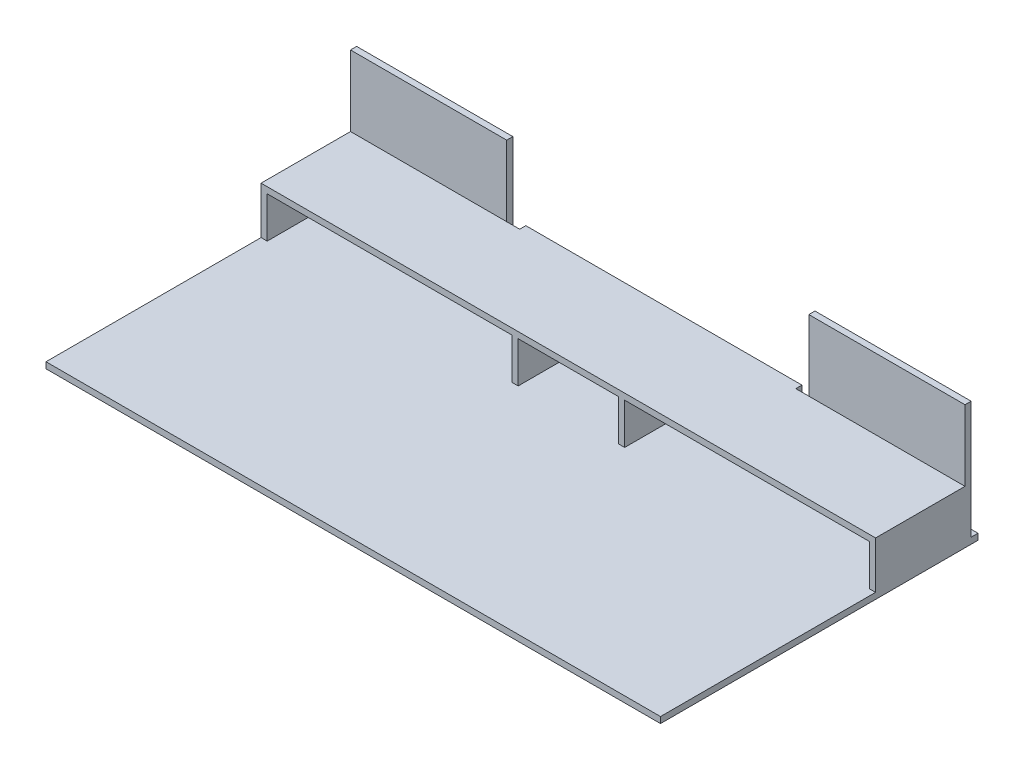
ISO-10303-21;
HEADER;
FILE_DESCRIPTION(('STEP AP214'),'2;1');
FILE_NAME('part.step','',(''),(''),'','','');
FILE_SCHEMA(('AUTOMOTIVE_DESIGN { 1 0 10303 214 1 1 1 1 }'));
ENDSEC;
DATA;
#1=APPLICATION_CONTEXT('core data for automotive mechanical design processes');
#2=APPLICATION_PROTOCOL_DEFINITION('international standard','automotive_design',2000,#1);
#3=PRODUCT_CONTEXT('',#1,'mechanical');
#4=PRODUCT('Part','Part','',(#3));
#5=PRODUCT_RELATED_PRODUCT_CATEGORY('part','',(#4));
#6=PRODUCT_DEFINITION_FORMATION('','',#4);
#7=PRODUCT_DEFINITION_CONTEXT('part definition',#1,'design');
#8=PRODUCT_DEFINITION('design','',#6,#7);
#9=PRODUCT_DEFINITION_SHAPE('','',#8);
#10=(LENGTH_UNIT() NAMED_UNIT(*) SI_UNIT(.MILLI.,.METRE.));
#11=(NAMED_UNIT(*) PLANE_ANGLE_UNIT() SI_UNIT($,.RADIAN.));
#12=(NAMED_UNIT(*) SI_UNIT($,.STERADIAN.) SOLID_ANGLE_UNIT());
#13=UNCERTAINTY_MEASURE_WITH_UNIT(LENGTH_MEASURE(1.E-05),#10,'distance_accuracy_value','');
#14=(GEOMETRIC_REPRESENTATION_CONTEXT(3) GLOBAL_UNCERTAINTY_ASSIGNED_CONTEXT((#13)) GLOBAL_UNIT_ASSIGNED_CONTEXT((#10,
#11,#12)) REPRESENTATION_CONTEXT('',''));
#15=CARTESIAN_POINT('',(0.,0.,0.));
#16=DIRECTION('',(0.,0.,1.));
#17=DIRECTION('',(1.,0.,0.));
#18=AXIS2_PLACEMENT_3D('',#15,#16,#17);
#19=CARTESIAN_POINT('',(0.,92.,-284.6));
#20=DIRECTION('',(0.,0.,-1.));
#21=DIRECTION('',(-1.,0.,0.));
#22=AXIS2_PLACEMENT_3D('',#19,#20,#21);
#23=PLANE('',#22);
#24=DIRECTION('',(-1.,0.,0.));
#25=VECTOR('',#24,1.);
#26=CARTESIAN_POINT('',(-600.,92.,-284.6));
#27=LINE('',#26,#25);
#28=CARTESIAN_POINT('',(295.,92.,-284.6));
#29=VERTEX_POINT('',#28);
#30=CARTESIAN_POINT('',(269.6,92.,-284.6));
#31=VERTEX_POINT('',#30);
#32=EDGE_CURVE('E556',#29,#31,#27,.T.);
#33=ORIENTED_EDGE('',*,*,#32,.T.);
#34=DIRECTION('',(0.,-1.,0.));
#35=VECTOR('',#34,1.);
#36=CARTESIAN_POINT('',(269.6,104.,-284.6));
#37=LINE('',#36,#35);
#38=CARTESIAN_POINT('',(269.6,104.,-284.6));
#39=VERTEX_POINT('',#38);
#40=EDGE_CURVE('E555',#39,#31,#37,.T.);
#41=ORIENTED_EDGE('',*,*,#40,.F.);
#42=DIRECTION('',(-1.,0.,0.));
#43=VECTOR('',#42,1.);
#44=CARTESIAN_POINT('',(-600.,104.,-284.6));
#45=LINE('',#44,#43);
#46=CARTESIAN_POINT('',(295.,104.,-284.6));
#47=VERTEX_POINT('',#46);
#48=EDGE_CURVE('E366',#47,#39,#45,.T.);
#49=ORIENTED_EDGE('',*,*,#48,.F.);
#50=DIRECTION('',(0.,-1.,0.));
#51=VECTOR('',#50,1.);
#52=CARTESIAN_POINT('',(295.,242.,-284.6));
#53=LINE('',#52,#51);
#54=EDGE_CURVE('E314',#47,#29,#53,.T.);
#55=ORIENTED_EDGE('',*,*,#54,.T.);
#56=EDGE_LOOP('',(#33,#41,#49,#55));
#57=FACE_BOUND('',#56,.T.);
#58=ADVANCED_FACE('F33',(#57),#23,.T.);
#59=DIRECTION('',(0.,-1.,0.));
#60=VECTOR('',#59,1.);
#61=CARTESIAN_POINT('',(-110.,92.,-284.6));
#62=LINE('',#61,#60);
#63=CARTESIAN_POINT('',(-110.,69.,-284.6));
#64=VERTEX_POINT('',#63);
#65=CARTESIAN_POINT('',(-110.,12.,-284.6));
#66=VERTEX_POINT('',#65);
#67=EDGE_CURVE('E445',#64,#66,#62,.T.);
#68=ORIENTED_EDGE('',*,*,#67,.F.);
#69=DIRECTION('',(-1.,0.,0.));
#70=VECTOR('',#69,1.);
#71=CARTESIAN_POINT('',(269.6,69.,-284.6));
#72=LINE('',#71,#70);
#73=CARTESIAN_POINT('',(-98.0000000000003,69.,-284.6));
#74=VERTEX_POINT('',#73);
#75=EDGE_CURVE('E560',#74,#64,#72,.T.);
#76=ORIENTED_EDGE('',*,*,#75,.F.);
#77=DIRECTION('',(0.,-1.,0.));
#78=VECTOR('',#77,1.);
#79=CARTESIAN_POINT('',(-98.0000000000003,92.,-284.6));
#80=LINE('',#79,#78);
#81=CARTESIAN_POINT('',(-98.0000000000003,12.,-284.6));
#82=VERTEX_POINT('',#81);
#83=EDGE_CURVE('E427',#74,#82,#80,.T.);
#84=ORIENTED_EDGE('',*,*,#83,.T.);
#85=DIRECTION('',(1.,0.,0.));
#86=VECTOR('',#85,1.);
#87=CARTESIAN_POINT('',(0.,12.,-284.6));
#88=LINE('',#87,#86);
#89=EDGE_CURVE('E420',#66,#82,#88,.T.);
#90=ORIENTED_EDGE('',*,*,#89,.F.);
#91=EDGE_LOOP('',(#68,#76,#84,#90));
#92=FACE_BOUND('',#91,.T.);
#93=ADVANCED_FACE('F605',(#92),#23,.T.);
#94=DIRECTION('',(0.,-1.,0.));
#95=VECTOR('',#94,1.);
#96=CARTESIAN_POINT('',(98.0000000000003,92.,-284.6));
#97=LINE('',#96,#95);
#98=CARTESIAN_POINT('',(98.0000000000003,69.,-284.6));
#99=VERTEX_POINT('',#98);
#100=CARTESIAN_POINT('',(98.0000000000003,12.,-284.6));
#101=VERTEX_POINT('',#100);
#102=EDGE_CURVE('E416',#99,#101,#97,.T.);
#103=ORIENTED_EDGE('',*,*,#102,.F.);
#104=CARTESIAN_POINT('',(110.,69.,-284.6));
#105=VERTEX_POINT('',#104);
#106=EDGE_CURVE('E567',#105,#99,#72,.T.);
#107=ORIENTED_EDGE('',*,*,#106,.F.);
#108=DIRECTION('',(0.,-1.,0.));
#109=VECTOR('',#108,1.);
#110=CARTESIAN_POINT('',(110.,92.,-284.6));
#111=LINE('',#110,#109);
#112=CARTESIAN_POINT('',(110.,12.,-284.6));
#113=VERTEX_POINT('',#112);
#114=EDGE_CURVE('E399',#105,#113,#111,.T.);
#115=ORIENTED_EDGE('',*,*,#114,.T.);
#116=DIRECTION('',(1.,0.,0.));
#117=VECTOR('',#116,1.);
#118=CARTESIAN_POINT('',(0.,12.,-284.6));
#119=LINE('',#118,#117);
#120=EDGE_CURVE('E392',#101,#113,#119,.T.);
#121=ORIENTED_EDGE('',*,*,#120,.F.);
#122=EDGE_LOOP('',(#103,#107,#115,#121));
#123=FACE_BOUND('',#122,.T.);
#124=ADVANCED_FACE('F627',(#123),#23,.T.);
#125=CARTESIAN_POINT('',(-269.6,104.,-284.6));
#126=VERTEX_POINT('',#125);
#127=CARTESIAN_POINT('',(-295.,104.,-284.6));
#128=VERTEX_POINT('',#127);
#129=EDGE_CURVE('E367',#126,#128,#45,.T.);
#130=ORIENTED_EDGE('',*,*,#129,.F.);
#131=DIRECTION('',(0.,1.,0.));
#132=VECTOR('',#131,1.);
#133=CARTESIAN_POINT('',(-269.6,104.,-284.6));
#134=LINE('',#133,#132);
#135=CARTESIAN_POINT('',(-269.6,92.,-284.6));
#136=VERTEX_POINT('',#135);
#137=EDGE_CURVE('E566',#136,#126,#134,.T.);
#138=ORIENTED_EDGE('',*,*,#137,.F.);
#139=CARTESIAN_POINT('',(-295.,92.,-284.6));
#140=VERTEX_POINT('',#139);
#141=EDGE_CURVE('E375',#136,#140,#27,.T.);
#142=ORIENTED_EDGE('',*,*,#141,.T.);
#143=DIRECTION('',(0.,-1.,0.));
#144=VECTOR('',#143,1.);
#145=CARTESIAN_POINT('',(-295.,242.,-284.6));
#146=LINE('',#145,#144);
#147=EDGE_CURVE('E346',#128,#140,#146,.T.);
#148=ORIENTED_EDGE('',*,*,#147,.F.);
#149=EDGE_LOOP('',(#130,#138,#142,#148));
#150=FACE_BOUND('',#149,.T.);
#151=ADVANCED_FACE('F577',(#150),#23,.T.);
#152=CARTESIAN_POINT('',(0.,12.,0.));
#153=DIRECTION('',(0.,1.,0.));
#154=DIRECTION('',(0.,0.,1.));
#155=AXIS2_PLACEMENT_3D('',#152,#153,#154);
#156=PLANE('',#155);
#157=ORIENTED_EDGE('',*,*,#120,.T.);
#158=DIRECTION('',(0.,0.,1.));
#159=VECTOR('',#158,1.);
#160=CARTESIAN_POINT('',(110.,12.,0.));
#161=LINE('',#160,#159);
#162=CARTESIAN_POINT('',(110.,12.,-110.));
#163=VERTEX_POINT('',#162);
#164=EDGE_CURVE('E396',#113,#163,#161,.T.);
#165=ORIENTED_EDGE('',*,*,#164,.T.);
#166=DIRECTION('',(-1.,0.,0.));
#167=VECTOR('',#166,1.);
#168=CARTESIAN_POINT('',(0.,12.,-110.));
#169=LINE('',#168,#167);
#170=CARTESIAN_POINT('',(98.0000000000004,12.,-110.));
#171=VERTEX_POINT('',#170);
#172=EDGE_CURVE('E405',#163,#171,#169,.T.);
#173=ORIENTED_EDGE('',*,*,#172,.T.);
#174=DIRECTION('',(0.,0.,1.));
#175=VECTOR('',#174,1.);
#176=CARTESIAN_POINT('',(98.0000000000004,12.,0.));
#177=LINE('',#176,#175);
#178=EDGE_CURVE('E402',#101,#171,#177,.T.);
#179=ORIENTED_EDGE('',*,*,#178,.F.);
#180=EDGE_LOOP('',(#157,#165,#173,#179));
#181=FACE_BOUND('',#180,.T.);
#182=ORIENTED_EDGE('',*,*,#89,.T.);
#183=DIRECTION('',(0.,0.,1.));
#184=VECTOR('',#183,1.);
#185=CARTESIAN_POINT('',(-98.0000000000003,12.,0.));
#186=LINE('',#185,#184);
#187=CARTESIAN_POINT('',(-98.0000000000003,12.,-110.));
#188=VERTEX_POINT('',#187);
#189=EDGE_CURVE('E424',#82,#188,#186,.T.);
#190=ORIENTED_EDGE('',*,*,#189,.T.);
#191=DIRECTION('',(1.,0.,0.));
#192=VECTOR('',#191,1.);
#193=CARTESIAN_POINT('',(0.,12.,-110.));
#194=LINE('',#193,#192);
#195=CARTESIAN_POINT('',(-110.,12.,-110.));
#196=VERTEX_POINT('',#195);
#197=EDGE_CURVE('E433',#196,#188,#194,.T.);
#198=ORIENTED_EDGE('',*,*,#197,.F.);
#199=DIRECTION('',(0.,0.,1.));
#200=VECTOR('',#199,1.);
#201=CARTESIAN_POINT('',(-110.,12.,0.));
#202=LINE('',#201,#200);
#203=EDGE_CURVE('E430',#66,#196,#202,.T.);
#204=ORIENTED_EDGE('',*,*,#203,.F.);
#205=EDGE_LOOP('',(#182,#190,#198,#204));
#206=FACE_BOUND('',#205,.T.);
#207=DIRECTION('',(0.,0.,1.));
#208=VECTOR('',#207,1.);
#209=CARTESIAN_POINT('',(295.,12.,-284.6));
#210=LINE('',#209,#208);
#211=CARTESIAN_POINT('',(295.,12.,-296.6));
#212=VERTEX_POINT('',#211);
#213=CARTESIAN_POINT('',(295.,12.,-284.6));
#214=VERTEX_POINT('',#213);
#215=EDGE_CURVE('E305',#212,#214,#210,.T.);
#216=ORIENTED_EDGE('',*,*,#215,.F.);
#217=DIRECTION('',(-1.,0.,0.));
#218=VECTOR('',#217,1.);
#219=CARTESIAN_POINT('',(600.,12.,-296.6));
#220=LINE('',#219,#218);
#221=CARTESIAN_POINT('',(600.,12.,-296.6));
#222=VERTEX_POINT('',#221);
#223=EDGE_CURVE('E288',#222,#212,#220,.T.);
#224=ORIENTED_EDGE('',*,*,#223,.F.);
#225=DIRECTION('',(0.,0.,-1.));
#226=VECTOR('',#225,1.);
#227=CARTESIAN_POINT('',(600.,12.,310.));
#228=LINE('',#227,#226);
#229=CARTESIAN_POINT('',(600.,12.,-310.));
#230=VERTEX_POINT('',#229);
#231=EDGE_CURVE('E472',#222,#230,#228,.T.);
#232=ORIENTED_EDGE('',*,*,#231,.T.);
#233=DIRECTION('',(-1.,0.,0.));
#234=VECTOR('',#233,1.);
#235=CARTESIAN_POINT('',(600.,12.,-310.));
#236=LINE('',#235,#234);
#237=CARTESIAN_POINT('',(-600.,12.,-310.));
#238=VERTEX_POINT('',#237);
#239=EDGE_CURVE('E475',#230,#238,#236,.T.);
#240=ORIENTED_EDGE('',*,*,#239,.T.);
#241=DIRECTION('',(0.,0.,1.));
#242=VECTOR('',#241,1.);
#243=CARTESIAN_POINT('',(-600.,12.,310.));
#244=LINE('',#243,#242);
#245=CARTESIAN_POINT('',(-600.,12.,-296.6));
#246=VERTEX_POINT('',#245);
#247=EDGE_CURVE('E466',#238,#246,#244,.T.);
#248=ORIENTED_EDGE('',*,*,#247,.T.);
#249=DIRECTION('',(-1.,0.,0.));
#250=VECTOR('',#249,1.);
#251=CARTESIAN_POINT('',(-600.,12.,-296.6));
#252=LINE('',#251,#250);
#253=CARTESIAN_POINT('',(-295.,12.,-296.6));
#254=VERTEX_POINT('',#253);
#255=EDGE_CURVE('E324',#254,#246,#252,.T.);
#256=ORIENTED_EDGE('',*,*,#255,.F.);
#257=DIRECTION('',(0.,0.,-1.));
#258=VECTOR('',#257,1.);
#259=CARTESIAN_POINT('',(-295.,12.,-284.6));
#260=LINE('',#259,#258);
#261=CARTESIAN_POINT('',(-295.,12.,-284.6));
#262=VERTEX_POINT('',#261);
#263=EDGE_CURVE('E333',#262,#254,#260,.T.);
#264=ORIENTED_EDGE('',*,*,#263,.F.);
#265=DIRECTION('',(1.,0.,0.));
#266=VECTOR('',#265,1.);
#267=CARTESIAN_POINT('',(-600.,12.,-284.6));
#268=LINE('',#267,#266);
#269=CARTESIAN_POINT('',(-588.,12.,-284.6));
#270=VERTEX_POINT('',#269);
#271=EDGE_CURVE('E319',#270,#262,#268,.T.);
#272=ORIENTED_EDGE('',*,*,#271,.F.);
#273=DIRECTION('',(0.,0.,1.));
#274=VECTOR('',#273,1.);
#275=CARTESIAN_POINT('',(-588.,12.,0.));
#276=LINE('',#275,#274);
#277=CARTESIAN_POINT('',(-588.,12.,-110.));
#278=VERTEX_POINT('',#277);
#279=EDGE_CURVE('E454',#270,#278,#276,.T.);
#280=ORIENTED_EDGE('',*,*,#279,.T.);
#281=DIRECTION('',(1.,0.,0.));
#282=VECTOR('',#281,1.);
#283=CARTESIAN_POINT('',(0.,12.,-110.));
#284=LINE('',#283,#282);
#285=CARTESIAN_POINT('',(-600.,12.,-110.));
#286=VERTEX_POINT('',#285);
#287=EDGE_CURVE('E449',#286,#278,#284,.T.);
#288=ORIENTED_EDGE('',*,*,#287,.F.);
#289=CARTESIAN_POINT('',(-600.,12.,310.));
#290=VERTEX_POINT('',#289);
#291=EDGE_CURVE('E470',#286,#290,#244,.T.);
#292=ORIENTED_EDGE('',*,*,#291,.T.);
#293=DIRECTION('',(1.,0.,0.));
#294=VECTOR('',#293,1.);
#295=CARTESIAN_POINT('',(600.,12.,310.));
#296=LINE('',#295,#294);
#297=CARTESIAN_POINT('',(600.,12.,310.));
#298=VERTEX_POINT('',#297);
#299=EDGE_CURVE('E469',#290,#298,#296,.T.);
#300=ORIENTED_EDGE('',*,*,#299,.T.);
#301=CARTESIAN_POINT('',(600.,12.,-110.));
#302=VERTEX_POINT('',#301);
#303=EDGE_CURVE('E473',#298,#302,#228,.T.);
#304=ORIENTED_EDGE('',*,*,#303,.T.);
#305=DIRECTION('',(-1.,0.,0.));
#306=VECTOR('',#305,1.);
#307=CARTESIAN_POINT('',(-1.27213054904965E-13,12.,-109.999999999999));
#308=LINE('',#307,#306);
#309=CARTESIAN_POINT('',(588.,12.,-110.));
#310=VERTEX_POINT('',#309);
#311=EDGE_CURVE('E380',#302,#310,#308,.T.);
#312=ORIENTED_EDGE('',*,*,#311,.T.);
#313=DIRECTION('',(0.,0.,1.));
#314=VECTOR('',#313,1.);
#315=CARTESIAN_POINT('',(588.,12.,0.));
#316=LINE('',#315,#314);
#317=CARTESIAN_POINT('',(588.,12.,-284.6));
#318=VERTEX_POINT('',#317);
#319=EDGE_CURVE('E365',#318,#310,#316,.T.);
#320=ORIENTED_EDGE('',*,*,#319,.F.);
#321=DIRECTION('',(1.,0.,0.));
#322=VECTOR('',#321,1.);
#323=CARTESIAN_POINT('',(600.,12.,-284.6));
#324=LINE('',#323,#322);
#325=EDGE_CURVE('E297',#214,#318,#324,.T.);
#326=ORIENTED_EDGE('',*,*,#325,.F.);
#327=EDGE_LOOP('',(#216,#224,#232,#240,#248,#256,#264,#272,#280,#288,#292,#300,#304,#312,#320,#326));
#328=FACE_BOUND('',#327,.T.);
#329=ADVANCED_FACE('F515',(#181,#206,#328),#156,.T.);
#330=CARTESIAN_POINT('',(-600.,12.,310.));
#331=DIRECTION('',(1.,0.,0.));
#332=DIRECTION('',(0.,0.,-1.));
#333=AXIS2_PLACEMENT_3D('',#330,#331,#332);
#334=PLANE('',#333);
#335=DIRECTION('',(0.,0.,1.));
#336=VECTOR('',#335,1.);
#337=CARTESIAN_POINT('',(-600.,0.,310.));
#338=LINE('',#337,#336);
#339=CARTESIAN_POINT('',(-600.,0.,-310.));
#340=VERTEX_POINT('',#339);
#341=CARTESIAN_POINT('',(-600.,0.,310.));
#342=VERTEX_POINT('',#341);
#343=EDGE_CURVE('E465',#340,#342,#338,.T.);
#344=ORIENTED_EDGE('',*,*,#343,.T.);
#345=DIRECTION('',(0.,-1.,0.));
#346=VECTOR('',#345,1.);
#347=CARTESIAN_POINT('',(-600.,12.,310.));
#348=LINE('',#347,#346);
#349=EDGE_CURVE('E11',#290,#342,#348,.T.);
#350=ORIENTED_EDGE('',*,*,#349,.F.);
#351=ORIENTED_EDGE('',*,*,#291,.F.);
#352=DIRECTION('',(0.,-1.,0.));
#353=VECTOR('',#352,1.);
#354=CARTESIAN_POINT('',(-600.,92.,-110.));
#355=LINE('',#354,#353);
#356=CARTESIAN_POINT('',(-600.,104.,-110.));
#357=VERTEX_POINT('',#356);
#358=EDGE_CURVE('E462',#357,#286,#355,.T.);
#359=ORIENTED_EDGE('',*,*,#358,.F.);
#360=DIRECTION('',(0.,0.,1.));
#361=VECTOR('',#360,1.);
#362=CARTESIAN_POINT('',(-600.,104.,-284.6));
#363=LINE('',#362,#361);
#364=CARTESIAN_POINT('',(-600.,104.,-284.6));
#365=VERTEX_POINT('',#364);
#366=EDGE_CURVE('E351',#365,#357,#363,.T.);
#367=ORIENTED_EDGE('',*,*,#366,.F.);
#368=DIRECTION('',(0.,-1.,0.));
#369=VECTOR('',#368,1.);
#370=CARTESIAN_POINT('',(-600.,242.,-284.6));
#371=LINE('',#370,#369);
#372=CARTESIAN_POINT('',(-600.,242.,-284.6));
#373=VERTEX_POINT('',#372);
#374=EDGE_CURVE('E345',#373,#365,#371,.T.);
#375=ORIENTED_EDGE('',*,*,#374,.F.);
#376=DIRECTION('',(0.,0.,1.));
#377=VECTOR('',#376,1.);
#378=CARTESIAN_POINT('',(-600.,242.,-284.6));
#379=LINE('',#378,#377);
#380=CARTESIAN_POINT('',(-600.,242.,-296.6));
#381=VERTEX_POINT('',#380);
#382=EDGE_CURVE('E320',#381,#373,#379,.T.);
#383=ORIENTED_EDGE('',*,*,#382,.F.);
#384=DIRECTION('',(0.,-1.,0.));
#385=VECTOR('',#384,1.);
#386=CARTESIAN_POINT('',(-600.,242.,-296.6));
#387=LINE('',#386,#385);
#388=EDGE_CURVE('E330',#381,#246,#387,.T.);
#389=ORIENTED_EDGE('',*,*,#388,.T.);
#390=ORIENTED_EDGE('',*,*,#247,.F.);
#391=DIRECTION('',(0.,-1.,0.));
#392=VECTOR('',#391,1.);
#393=CARTESIAN_POINT('',(-600.,12.,-310.));
#394=LINE('',#393,#392);
#395=EDGE_CURVE('E477',#238,#340,#394,.T.);
#396=ORIENTED_EDGE('',*,*,#395,.T.);
#397=EDGE_LOOP('',(#344,#350,#351,#359,#367,#375,#383,#389,#390,#396));
#398=FACE_BOUND('',#397,.T.);
#399=ADVANCED_FACE('F35',(#398),#334,.F.);
#400=CARTESIAN_POINT('',(600.,12.,310.));
#401=DIRECTION('',(0.,0.,-1.));
#402=DIRECTION('',(-1.,0.,0.));
#403=AXIS2_PLACEMENT_3D('',#400,#401,#402);
#404=PLANE('',#403);
#405=DIRECTION('',(1.,0.,0.));
#406=VECTOR('',#405,1.);
#407=CARTESIAN_POINT('',(600.,0.,310.));
#408=LINE('',#407,#406);
#409=CARTESIAN_POINT('',(600.,0.,310.));
#410=VERTEX_POINT('',#409);
#411=EDGE_CURVE('E480',#342,#410,#408,.T.);
#412=ORIENTED_EDGE('',*,*,#411,.T.);
#413=DIRECTION('',(0.,-1.,0.));
#414=VECTOR('',#413,1.);
#415=CARTESIAN_POINT('',(600.,12.,310.));
#416=LINE('',#415,#414);
#417=EDGE_CURVE('E41',#298,#410,#416,.T.);
#418=ORIENTED_EDGE('',*,*,#417,.F.);
#419=ORIENTED_EDGE('',*,*,#299,.F.);
#420=ORIENTED_EDGE('',*,*,#349,.T.);
#421=EDGE_LOOP('',(#412,#418,#419,#420));
#422=FACE_BOUND('',#421,.T.);
#423=ADVANCED_FACE('F541',(#422),#404,.F.);
#424=CARTESIAN_POINT('',(600.,12.,310.));
#425=DIRECTION('',(-1.,0.,0.));
#426=DIRECTION('',(0.,0.,1.));
#427=AXIS2_PLACEMENT_3D('',#424,#425,#426);
#428=PLANE('',#427);
#429=DIRECTION('',(0.,0.,-1.));
#430=VECTOR('',#429,1.);
#431=CARTESIAN_POINT('',(600.,0.,310.));
#432=LINE('',#431,#430);
#433=CARTESIAN_POINT('',(600.,0.,-310.));
#434=VERTEX_POINT('',#433);
#435=EDGE_CURVE('E482',#410,#434,#432,.T.);
#436=ORIENTED_EDGE('',*,*,#435,.T.);
#437=DIRECTION('',(0.,-1.,0.));
#438=VECTOR('',#437,1.);
#439=CARTESIAN_POINT('',(600.,12.,-310.));
#440=LINE('',#439,#438);
#441=EDGE_CURVE('E488',#230,#434,#440,.T.);
#442=ORIENTED_EDGE('',*,*,#441,.F.);
#443=ORIENTED_EDGE('',*,*,#231,.F.);
#444=DIRECTION('',(0.,-1.,0.));
#445=VECTOR('',#444,1.);
#446=CARTESIAN_POINT('',(600.,242.,-296.6));
#447=LINE('',#446,#445);
#448=CARTESIAN_POINT('',(600.,242.,-296.6));
#449=VERTEX_POINT('',#448);
#450=EDGE_CURVE('E317',#449,#222,#447,.T.);
#451=ORIENTED_EDGE('',*,*,#450,.F.);
#452=DIRECTION('',(0.,0.,-1.));
#453=VECTOR('',#452,1.);
#454=CARTESIAN_POINT('',(600.,242.,-284.6));
#455=LINE('',#454,#453);
#456=CARTESIAN_POINT('',(600.,242.,-284.6));
#457=VERTEX_POINT('',#456);
#458=EDGE_CURVE('E293',#457,#449,#455,.T.);
#459=ORIENTED_EDGE('',*,*,#458,.F.);
#460=DIRECTION('',(0.,-1.,0.));
#461=VECTOR('',#460,1.);
#462=CARTESIAN_POINT('',(600.,242.,-284.6));
#463=LINE('',#462,#461);
#464=CARTESIAN_POINT('',(600.,104.,-284.6));
#465=VERTEX_POINT('',#464);
#466=EDGE_CURVE('E303',#457,#465,#463,.T.);
#467=ORIENTED_EDGE('',*,*,#466,.T.);
#468=DIRECTION('',(0.,0.,-1.));
#469=VECTOR('',#468,1.);
#470=CARTESIAN_POINT('',(600.,104.,-284.6));
#471=LINE('',#470,#469);
#472=CARTESIAN_POINT('',(600.,104.,-110.));
#473=VERTEX_POINT('',#472);
#474=EDGE_CURVE('E358',#473,#465,#471,.T.);
#475=ORIENTED_EDGE('',*,*,#474,.F.);
#476=DIRECTION('',(0.,-1.,0.));
#477=VECTOR('',#476,1.);
#478=CARTESIAN_POINT('',(600.,92.,-110.));
#479=LINE('',#478,#477);
#480=EDGE_CURVE('E379',#473,#302,#479,.T.);
#481=ORIENTED_EDGE('',*,*,#480,.T.);
#482=ORIENTED_EDGE('',*,*,#303,.F.);
#483=ORIENTED_EDGE('',*,*,#417,.T.);
#484=EDGE_LOOP('',(#436,#442,#443,#451,#459,#467,#475,#481,#482,#483));
#485=FACE_BOUND('',#484,.T.);
#486=ADVANCED_FACE('F495',(#485),#428,.F.);
#487=CARTESIAN_POINT('',(600.,12.,-310.));
#488=DIRECTION('',(0.,0.,1.));
#489=DIRECTION('',(1.,0.,0.));
#490=AXIS2_PLACEMENT_3D('',#487,#488,#489);
#491=PLANE('',#490);
#492=DIRECTION('',(-1.,0.,0.));
#493=VECTOR('',#492,1.);
#494=CARTESIAN_POINT('',(600.,0.,-310.));
#495=LINE('',#494,#493);
#496=EDGE_CURVE('E484',#434,#340,#495,.T.);
#497=ORIENTED_EDGE('',*,*,#496,.T.);
#498=ORIENTED_EDGE('',*,*,#395,.F.);
#499=ORIENTED_EDGE('',*,*,#239,.F.);
#500=ORIENTED_EDGE('',*,*,#441,.T.);
#501=EDGE_LOOP('',(#497,#498,#499,#500));
#502=FACE_BOUND('',#501,.T.);
#503=ADVANCED_FACE('F505',(#502),#491,.F.);
#504=CARTESIAN_POINT('',(0.,0.,0.));
#505=DIRECTION('',(0.,1.,0.));
#506=DIRECTION('',(0.,0.,1.));
#507=AXIS2_PLACEMENT_3D('',#504,#505,#506);
#508=PLANE('',#507);
#509=ORIENTED_EDGE('',*,*,#343,.F.);
#510=ORIENTED_EDGE('',*,*,#496,.F.);
#511=ORIENTED_EDGE('',*,*,#435,.F.);
#512=ORIENTED_EDGE('',*,*,#411,.F.);
#513=EDGE_LOOP('',(#509,#510,#511,#512));
#514=FACE_BOUND('',#513,.T.);
#515=ADVANCED_FACE('F502',(#514),#508,.F.);
#516=CARTESIAN_POINT('',(0.,92.,-110.));
#517=DIRECTION('',(0.,0.,-1.));
#518=DIRECTION('',(-1.,0.,0.));
#519=AXIS2_PLACEMENT_3D('',#516,#517,#518);
#520=PLANE('',#519);
#521=ORIENTED_EDGE('',*,*,#287,.T.);
#522=DIRECTION('',(0.,-1.,0.));
#523=VECTOR('',#522,1.);
#524=CARTESIAN_POINT('',(-588.,92.,-110.));
#525=LINE('',#524,#523);
#526=CARTESIAN_POINT('',(-588.,92.,-110.));
#527=VERTEX_POINT('',#526);
#528=EDGE_CURVE('E459',#527,#278,#525,.T.);
#529=ORIENTED_EDGE('',*,*,#528,.F.);
#530=DIRECTION('',(1.,0.,0.));
#531=VECTOR('',#530,1.);
#532=CARTESIAN_POINT('',(-600.,92.,-110.));
#533=LINE('',#532,#531);
#534=CARTESIAN_POINT('',(-110.,92.,-110.));
#535=VERTEX_POINT('',#534);
#536=EDGE_CURVE('E371',#527,#535,#533,.T.);
#537=ORIENTED_EDGE('',*,*,#536,.T.);
#538=DIRECTION('',(0.,-1.,0.));
#539=VECTOR('',#538,1.);
#540=CARTESIAN_POINT('',(-110.,92.,-110.));
#541=LINE('',#540,#539);
#542=EDGE_CURVE('E442',#535,#196,#541,.T.);
#543=ORIENTED_EDGE('',*,*,#542,.T.);
#544=ORIENTED_EDGE('',*,*,#197,.T.);
#545=DIRECTION('',(0.,-1.,0.));
#546=VECTOR('',#545,1.);
#547=CARTESIAN_POINT('',(-98.0000000000003,92.,-110.));
#548=LINE('',#547,#546);
#549=CARTESIAN_POINT('',(-98.0000000000003,92.,-110.));
#550=VERTEX_POINT('',#549);
#551=EDGE_CURVE('E439',#550,#188,#548,.T.);
#552=ORIENTED_EDGE('',*,*,#551,.F.);
#553=CARTESIAN_POINT('',(98.0000000000003,92.,-110.));
#554=VERTEX_POINT('',#553);
#555=EDGE_CURVE('E370',#550,#554,#533,.T.);
#556=ORIENTED_EDGE('',*,*,#555,.T.);
#557=DIRECTION('',(0.,-1.,0.));
#558=VECTOR('',#557,1.);
#559=CARTESIAN_POINT('',(98.0000000000004,92.,-110.));
#560=LINE('',#559,#558);
#561=EDGE_CURVE('E413',#554,#171,#560,.T.);
#562=ORIENTED_EDGE('',*,*,#561,.T.);
#563=ORIENTED_EDGE('',*,*,#172,.F.);
#564=DIRECTION('',(0.,-1.,0.));
#565=VECTOR('',#564,1.);
#566=CARTESIAN_POINT('',(110.,92.,-110.));
#567=LINE('',#566,#565);
#568=CARTESIAN_POINT('',(110.,92.,-110.));
#569=VERTEX_POINT('',#568);
#570=EDGE_CURVE('E410',#569,#163,#567,.T.);
#571=ORIENTED_EDGE('',*,*,#570,.F.);
#572=CARTESIAN_POINT('',(588.,92.,-110.));
#573=VERTEX_POINT('',#572);
#574=EDGE_CURVE('E350',#569,#573,#533,.T.);
#575=ORIENTED_EDGE('',*,*,#574,.T.);
#576=DIRECTION('',(0.,-1.,0.));
#577=VECTOR('',#576,1.);
#578=CARTESIAN_POINT('',(588.,92.,-110.));
#579=LINE('',#578,#577);
#580=EDGE_CURVE('E386',#573,#310,#579,.T.);
#581=ORIENTED_EDGE('',*,*,#580,.T.);
#582=ORIENTED_EDGE('',*,*,#311,.F.);
#583=ORIENTED_EDGE('',*,*,#480,.F.);
#584=DIRECTION('',(1.,0.,0.));
#585=VECTOR('',#584,1.);
#586=CARTESIAN_POINT('',(-600.,104.,-110.));
#587=LINE('',#586,#585);
#588=EDGE_CURVE('E354',#357,#473,#587,.T.);
#589=ORIENTED_EDGE('',*,*,#588,.F.);
#590=ORIENTED_EDGE('',*,*,#358,.T.);
#591=EDGE_LOOP('',(#521,#529,#537,#543,#544,#552,#556,#562,#563,#571,#575,#581,#582,#583,#589,#590));
#592=FACE_BOUND('',#591,.T.);
#593=ADVANCED_FACE('F536',(#592),#520,.F.);
#594=CARTESIAN_POINT('',(-588.,92.,0.));
#595=DIRECTION('',(1.,0.,0.));
#596=DIRECTION('',(0.,0.,-1.));
#597=AXIS2_PLACEMENT_3D('',#594,#595,#596);
#598=PLANE('',#597);
#599=ORIENTED_EDGE('',*,*,#279,.F.);
#600=DIRECTION('',(0.,-1.,0.));
#601=VECTOR('',#600,1.);
#602=CARTESIAN_POINT('',(-588.,92.,-284.6));
#603=LINE('',#602,#601);
#604=CARTESIAN_POINT('',(-588.,92.,-284.6));
#605=VERTEX_POINT('',#604);
#606=EDGE_CURVE('E453',#605,#270,#603,.T.);
#607=ORIENTED_EDGE('',*,*,#606,.F.);
#608=DIRECTION('',(0.,0.,1.));
#609=VECTOR('',#608,1.);
#610=CARTESIAN_POINT('',(-588.,92.,0.));
#611=LINE('',#610,#609);
#612=EDGE_CURVE('E450',#605,#527,#611,.T.);
#613=ORIENTED_EDGE('',*,*,#612,.T.);
#614=ORIENTED_EDGE('',*,*,#528,.T.);
#615=EDGE_LOOP('',(#599,#607,#613,#614));
#616=FACE_BOUND('',#615,.T.);
#617=ADVANCED_FACE('F590',(#616),#598,.T.);
#618=CARTESIAN_POINT('',(-110.,92.,0.));
#619=DIRECTION('',(1.,0.,0.));
#620=DIRECTION('',(0.,0.,-1.));
#621=AXIS2_PLACEMENT_3D('',#618,#619,#620);
#622=PLANE('',#621);
#623=ORIENTED_EDGE('',*,*,#203,.T.);
#624=ORIENTED_EDGE('',*,*,#542,.F.);
#625=DIRECTION('',(0.,0.,1.));
#626=VECTOR('',#625,1.);
#627=CARTESIAN_POINT('',(-110.,92.,0.));
#628=LINE('',#627,#626);
#629=CARTESIAN_POINT('',(-110.,92.,-284.6));
#630=VERTEX_POINT('',#629);
#631=EDGE_CURVE('E421',#630,#535,#628,.T.);
#632=ORIENTED_EDGE('',*,*,#631,.F.);
#633=EDGE_CURVE('E446',#630,#64,#62,.T.);
#634=ORIENTED_EDGE('',*,*,#633,.T.);
#635=ORIENTED_EDGE('',*,*,#67,.T.);
#636=EDGE_LOOP('',(#623,#624,#632,#634,#635));
#637=FACE_BOUND('',#636,.T.);
#638=ADVANCED_FACE('F598',(#637),#622,.F.);
#639=CARTESIAN_POINT('',(-98.0000000000003,92.,0.));
#640=DIRECTION('',(1.,0.,0.));
#641=DIRECTION('',(0.,0.,-1.));
#642=AXIS2_PLACEMENT_3D('',#639,#640,#641);
#643=PLANE('',#642);
#644=ORIENTED_EDGE('',*,*,#189,.F.);
#645=ORIENTED_EDGE('',*,*,#83,.F.);
#646=CARTESIAN_POINT('',(-98.0000000000003,92.,-284.6));
#647=VERTEX_POINT('',#646);
#648=EDGE_CURVE('E437',#647,#74,#80,.T.);
#649=ORIENTED_EDGE('',*,*,#648,.F.);
#650=DIRECTION('',(0.,0.,1.));
#651=VECTOR('',#650,1.);
#652=CARTESIAN_POINT('',(-98.0000000000003,92.,0.));
#653=LINE('',#652,#651);
#654=EDGE_CURVE('E423',#647,#550,#653,.T.);
#655=ORIENTED_EDGE('',*,*,#654,.T.);
#656=ORIENTED_EDGE('',*,*,#551,.T.);
#657=EDGE_LOOP('',(#644,#645,#649,#655,#656));
#658=FACE_BOUND('',#657,.T.);
#659=ADVANCED_FACE('F611',(#658),#643,.T.);
#660=CARTESIAN_POINT('',(98.0000000000004,92.,0.));
#661=DIRECTION('',(1.,0.,0.));
#662=DIRECTION('',(0.,0.,-1.));
#663=AXIS2_PLACEMENT_3D('',#660,#661,#662);
#664=PLANE('',#663);
#665=ORIENTED_EDGE('',*,*,#178,.T.);
#666=ORIENTED_EDGE('',*,*,#561,.F.);
#667=DIRECTION('',(0.,0.,1.));
#668=VECTOR('',#667,1.);
#669=CARTESIAN_POINT('',(98.0000000000004,92.,0.));
#670=LINE('',#669,#668);
#671=CARTESIAN_POINT('',(98.0000000000003,92.,-284.6));
#672=VERTEX_POINT('',#671);
#673=EDGE_CURVE('E393',#672,#554,#670,.T.);
#674=ORIENTED_EDGE('',*,*,#673,.F.);
#675=EDGE_CURVE('E417',#672,#99,#97,.T.);
#676=ORIENTED_EDGE('',*,*,#675,.T.);
#677=ORIENTED_EDGE('',*,*,#102,.T.);
#678=EDGE_LOOP('',(#665,#666,#674,#676,#677));
#679=FACE_BOUND('',#678,.T.);
#680=ADVANCED_FACE('F620',(#679),#664,.F.);
#681=CARTESIAN_POINT('',(110.,92.,0.));
#682=DIRECTION('',(1.,0.,0.));
#683=DIRECTION('',(0.,0.,-1.));
#684=AXIS2_PLACEMENT_3D('',#681,#682,#683);
#685=PLANE('',#684);
#686=ORIENTED_EDGE('',*,*,#164,.F.);
#687=ORIENTED_EDGE('',*,*,#114,.F.);
#688=CARTESIAN_POINT('',(110.,92.,-284.6));
#689=VERTEX_POINT('',#688);
#690=EDGE_CURVE('E408',#689,#105,#111,.T.);
#691=ORIENTED_EDGE('',*,*,#690,.F.);
#692=DIRECTION('',(0.,0.,1.));
#693=VECTOR('',#692,1.);
#694=CARTESIAN_POINT('',(110.,92.,0.));
#695=LINE('',#694,#693);
#696=EDGE_CURVE('E395',#689,#569,#695,.T.);
#697=ORIENTED_EDGE('',*,*,#696,.T.);
#698=ORIENTED_EDGE('',*,*,#570,.T.);
#699=EDGE_LOOP('',(#686,#687,#691,#697,#698));
#700=FACE_BOUND('',#699,.T.);
#701=ADVANCED_FACE('F633',(#700),#685,.T.);
#702=CARTESIAN_POINT('',(588.,92.,0.));
#703=DIRECTION('',(1.,0.,0.));
#704=DIRECTION('',(0.,0.,-1.));
#705=AXIS2_PLACEMENT_3D('',#702,#703,#704);
#706=PLANE('',#705);
#707=ORIENTED_EDGE('',*,*,#319,.T.);
#708=ORIENTED_EDGE('',*,*,#580,.F.);
#709=DIRECTION('',(0.,0.,1.));
#710=VECTOR('',#709,1.);
#711=CARTESIAN_POINT('',(588.,92.,0.));
#712=LINE('',#711,#710);
#713=CARTESIAN_POINT('',(588.,92.,-284.6));
#714=VERTEX_POINT('',#713);
#715=EDGE_CURVE('E376',#714,#573,#712,.T.);
#716=ORIENTED_EDGE('',*,*,#715,.F.);
#717=DIRECTION('',(0.,-1.,0.));
#718=VECTOR('',#717,1.);
#719=CARTESIAN_POINT('',(588.,92.,-284.6));
#720=LINE('',#719,#718);
#721=EDGE_CURVE('E389',#714,#318,#720,.T.);
#722=ORIENTED_EDGE('',*,*,#721,.T.);
#723=EDGE_LOOP('',(#707,#708,#716,#722));
#724=FACE_BOUND('',#723,.T.);
#725=ADVANCED_FACE('F641',(#724),#706,.F.);
#726=CARTESIAN_POINT('',(0.,92.,0.));
#727=DIRECTION('',(0.,1.,0.));
#728=DIRECTION('',(0.,0.,1.));
#729=AXIS2_PLACEMENT_3D('',#726,#727,#728);
#730=PLANE('',#729);
#731=ORIENTED_EDGE('',*,*,#612,.F.);
#732=DIRECTION('',(-1.,0.,0.));
#733=VECTOR('',#732,1.);
#734=CARTESIAN_POINT('',(0.,92.,-284.6));
#735=LINE('',#734,#733);
#736=EDGE_CURVE('E348',#140,#605,#735,.T.);
#737=ORIENTED_EDGE('',*,*,#736,.F.);
#738=ORIENTED_EDGE('',*,*,#141,.F.);
#739=EDGE_CURVE('E372',#630,#136,#27,.T.);
#740=ORIENTED_EDGE('',*,*,#739,.F.);
#741=ORIENTED_EDGE('',*,*,#631,.T.);
#742=ORIENTED_EDGE('',*,*,#536,.F.);
#743=EDGE_LOOP('',(#731,#737,#738,#740,#741,#742));
#744=FACE_BOUND('',#743,.T.);
#745=ADVANCED_FACE('F769',(#744),#730,.F.);
#746=ORIENTED_EDGE('',*,*,#654,.F.);
#747=EDGE_CURVE('E374',#672,#647,#27,.T.);
#748=ORIENTED_EDGE('',*,*,#747,.F.);
#749=ORIENTED_EDGE('',*,*,#673,.T.);
#750=ORIENTED_EDGE('',*,*,#555,.F.);
#751=EDGE_LOOP('',(#746,#748,#749,#750));
#752=FACE_BOUND('',#751,.T.);
#753=ADVANCED_FACE('F878',(#752),#730,.F.);
#754=ORIENTED_EDGE('',*,*,#696,.F.);
#755=DIRECTION('',(-1.,0.,0.));
#756=VECTOR('',#755,1.);
#757=CARTESIAN_POINT('',(0.,92.,-284.6));
#758=LINE('',#757,#756);
#759=EDGE_CURVE('E286',#31,#689,#758,.T.);
#760=ORIENTED_EDGE('',*,*,#759,.F.);
#761=ORIENTED_EDGE('',*,*,#32,.F.);
#762=EDGE_CURVE('E355',#714,#29,#27,.T.);
#763=ORIENTED_EDGE('',*,*,#762,.F.);
#764=ORIENTED_EDGE('',*,*,#715,.T.);
#765=ORIENTED_EDGE('',*,*,#574,.F.);
#766=EDGE_LOOP('',(#754,#760,#761,#763,#764,#765));
#767=FACE_BOUND('',#766,.T.);
#768=ADVANCED_FACE('F637',(#767),#730,.F.);
#769=CARTESIAN_POINT('',(0.,104.,0.));
#770=DIRECTION('',(0.,1.,0.));
#771=DIRECTION('',(0.,0.,1.));
#772=AXIS2_PLACEMENT_3D('',#769,#770,#771);
#773=PLANE('',#772);
#774=ORIENTED_EDGE('',*,*,#366,.T.);
#775=ORIENTED_EDGE('',*,*,#588,.T.);
#776=ORIENTED_EDGE('',*,*,#474,.T.);
#777=EDGE_CURVE('E362',#465,#47,#45,.T.);
#778=ORIENTED_EDGE('',*,*,#777,.T.);
#779=ORIENTED_EDGE('',*,*,#48,.T.);
#780=DIRECTION('',(0.,0.,1.));
#781=VECTOR('',#780,1.);
#782=CARTESIAN_POINT('',(269.6,104.,-296.6));
#783=LINE('',#782,#781);
#784=CARTESIAN_POINT('',(269.6,104.,-296.6));
#785=VERTEX_POINT('',#784);
#786=EDGE_CURVE('E549',#785,#39,#783,.T.);
#787=ORIENTED_EDGE('',*,*,#786,.F.);
#788=DIRECTION('',(1.,0.,0.));
#789=VECTOR('',#788,1.);
#790=CARTESIAN_POINT('',(269.6,104.,-296.6));
#791=LINE('',#790,#789);
#792=CARTESIAN_POINT('',(-269.6,104.,-296.6));
#793=VERTEX_POINT('',#792);
#794=EDGE_CURVE('E277',#793,#785,#791,.T.);
#795=ORIENTED_EDGE('',*,*,#794,.F.);
#796=DIRECTION('',(0.,0.,1.));
#797=VECTOR('',#796,1.);
#798=CARTESIAN_POINT('',(-269.6,104.,-296.6));
#799=LINE('',#798,#797);
#800=EDGE_CURVE('E48',#793,#126,#799,.T.);
#801=ORIENTED_EDGE('',*,*,#800,.T.);
#802=ORIENTED_EDGE('',*,*,#129,.T.);
#803=EDGE_CURVE('E361',#128,#365,#45,.T.);
#804=ORIENTED_EDGE('',*,*,#803,.T.);
#805=EDGE_LOOP('',(#774,#775,#776,#778,#779,#787,#795,#801,#802,#804));
#806=FACE_BOUND('',#805,.T.);
#807=ADVANCED_FACE('F530',(#806),#773,.T.);
#808=CARTESIAN_POINT('',(-600.,242.,-284.6));
#809=DIRECTION('',(0.,0.,-1.));
#810=DIRECTION('',(-1.,0.,0.));
#811=AXIS2_PLACEMENT_3D('',#808,#809,#810);
#812=PLANE('',#811);
#813=ORIENTED_EDGE('',*,*,#606,.T.);
#814=ORIENTED_EDGE('',*,*,#271,.T.);
#815=EDGE_CURVE('E341',#140,#262,#146,.T.);
#816=ORIENTED_EDGE('',*,*,#815,.F.);
#817=ORIENTED_EDGE('',*,*,#736,.T.);
#818=EDGE_LOOP('',(#813,#814,#816,#817));
#819=FACE_BOUND('',#818,.T.);
#820=ADVANCED_FACE('F586',(#819),#812,.F.);
#821=ORIENTED_EDGE('',*,*,#803,.F.);
#822=CARTESIAN_POINT('',(-295.,242.,-284.6));
#823=VERTEX_POINT('',#822);
#824=EDGE_CURVE('E342',#823,#128,#146,.T.);
#825=ORIENTED_EDGE('',*,*,#824,.F.);
#826=DIRECTION('',(1.,0.,0.));
#827=VECTOR('',#826,1.);
#828=CARTESIAN_POINT('',(-600.,242.,-284.6));
#829=LINE('',#828,#827);
#830=EDGE_CURVE('E323',#373,#823,#829,.T.);
#831=ORIENTED_EDGE('',*,*,#830,.F.);
#832=ORIENTED_EDGE('',*,*,#374,.T.);
#833=EDGE_LOOP('',(#821,#825,#831,#832));
#834=FACE_BOUND('',#833,.T.);
#835=ADVANCED_FACE('F545',(#834),#812,.F.);
#836=CARTESIAN_POINT('',(-295.,242.,-284.6));
#837=DIRECTION('',(-1.,0.,0.));
#838=DIRECTION('',(0.,0.,1.));
#839=AXIS2_PLACEMENT_3D('',#836,#837,#838);
#840=PLANE('',#839);
#841=ORIENTED_EDGE('',*,*,#263,.T.);
#842=DIRECTION('',(0.,-1.,0.));
#843=VECTOR('',#842,1.);
#844=CARTESIAN_POINT('',(-295.,242.,-296.6));
#845=LINE('',#844,#843);
#846=CARTESIAN_POINT('',(-295.,242.,-296.6));
#847=VERTEX_POINT('',#846);
#848=EDGE_CURVE('E338',#847,#254,#845,.T.);
#849=ORIENTED_EDGE('',*,*,#848,.F.);
#850=DIRECTION('',(0.,0.,-1.));
#851=VECTOR('',#850,1.);
#852=CARTESIAN_POINT('',(-295.,242.,-284.6));
#853=LINE('',#852,#851);
#854=EDGE_CURVE('E326',#823,#847,#853,.T.);
#855=ORIENTED_EDGE('',*,*,#854,.F.);
#856=ORIENTED_EDGE('',*,*,#824,.T.);
#857=ORIENTED_EDGE('',*,*,#147,.T.);
#858=ORIENTED_EDGE('',*,*,#815,.T.);
#859=EDGE_LOOP('',(#841,#849,#855,#856,#857,#858));
#860=FACE_BOUND('',#859,.T.);
#861=ADVANCED_FACE('F582',(#860),#840,.F.);
#862=CARTESIAN_POINT('',(-600.,242.,-296.6));
#863=DIRECTION('',(0.,0.,1.));
#864=DIRECTION('',(1.,0.,0.));
#865=AXIS2_PLACEMENT_3D('',#862,#863,#864);
#866=PLANE('',#865);
#867=ORIENTED_EDGE('',*,*,#255,.T.);
#868=ORIENTED_EDGE('',*,*,#388,.F.);
#869=DIRECTION('',(-1.,0.,0.));
#870=VECTOR('',#869,1.);
#871=CARTESIAN_POINT('',(-600.,242.,-296.6));
#872=LINE('',#871,#870);
#873=EDGE_CURVE('E328',#847,#381,#872,.T.);
#874=ORIENTED_EDGE('',*,*,#873,.F.);
#875=ORIENTED_EDGE('',*,*,#848,.T.);
#876=EDGE_LOOP('',(#867,#868,#874,#875));
#877=FACE_BOUND('',#876,.T.);
#878=ADVANCED_FACE('F725',(#877),#866,.F.);
#879=CARTESIAN_POINT('',(0.,242.,0.));
#880=DIRECTION('',(0.,-1.,0.));
#881=DIRECTION('',(0.,0.,-1.));
#882=AXIS2_PLACEMENT_3D('',#879,#880,#881);
#883=PLANE('',#882);
#884=ORIENTED_EDGE('',*,*,#382,.T.);
#885=ORIENTED_EDGE('',*,*,#830,.T.);
#886=ORIENTED_EDGE('',*,*,#854,.T.);
#887=ORIENTED_EDGE('',*,*,#873,.T.);
#888=EDGE_LOOP('',(#884,#885,#886,#887));
#889=FACE_BOUND('',#888,.T.);
#890=ADVANCED_FACE('F717',(#889),#883,.F.);
#891=CARTESIAN_POINT('',(600.,242.,-284.6));
#892=DIRECTION('',(0.,0.,-1.));
#893=DIRECTION('',(-1.,0.,0.));
#894=AXIS2_PLACEMENT_3D('',#891,#892,#893);
#895=PLANE('',#894);
#896=ORIENTED_EDGE('',*,*,#325,.T.);
#897=ORIENTED_EDGE('',*,*,#721,.F.);
#898=ORIENTED_EDGE('',*,*,#762,.T.);
#899=EDGE_CURVE('E311',#29,#214,#53,.T.);
#900=ORIENTED_EDGE('',*,*,#899,.T.);
#901=EDGE_LOOP('',(#896,#897,#898,#900));
#902=FACE_BOUND('',#901,.T.);
#903=ADVANCED_FACE('F643',(#902),#895,.F.);
#904=CARTESIAN_POINT('',(600.,242.,-296.6));
#905=DIRECTION('',(0.,0.,1.));
#906=DIRECTION('',(1.,0.,0.));
#907=AXIS2_PLACEMENT_3D('',#904,#905,#906);
#908=PLANE('',#907);
#909=ORIENTED_EDGE('',*,*,#223,.T.);
#910=DIRECTION('',(0.,-1.,0.));
#911=VECTOR('',#910,1.);
#912=CARTESIAN_POINT('',(295.,242.,-296.6));
#913=LINE('',#912,#911);
#914=CARTESIAN_POINT('',(295.,242.,-296.6));
#915=VERTEX_POINT('',#914);
#916=EDGE_CURVE('E313',#915,#212,#913,.T.);
#917=ORIENTED_EDGE('',*,*,#916,.F.);
#918=DIRECTION('',(-1.,0.,0.));
#919=VECTOR('',#918,1.);
#920=CARTESIAN_POINT('',(600.,242.,-296.6));
#921=LINE('',#920,#919);
#922=EDGE_CURVE('E296',#449,#915,#921,.T.);
#923=ORIENTED_EDGE('',*,*,#922,.F.);
#924=ORIENTED_EDGE('',*,*,#450,.T.);
#925=EDGE_LOOP('',(#909,#917,#923,#924));
#926=FACE_BOUND('',#925,.T.);
#927=ADVANCED_FACE('F522',(#926),#908,.F.);
#928=CARTESIAN_POINT('',(295.,242.,-284.6));
#929=DIRECTION('',(1.,0.,0.));
#930=DIRECTION('',(0.,0.,-1.));
#931=AXIS2_PLACEMENT_3D('',#928,#929,#930);
#932=PLANE('',#931);
#933=ORIENTED_EDGE('',*,*,#215,.T.);
#934=ORIENTED_EDGE('',*,*,#899,.F.);
#935=ORIENTED_EDGE('',*,*,#54,.F.);
#936=CARTESIAN_POINT('',(295.,242.,-284.6));
#937=VERTEX_POINT('',#936);
#938=EDGE_CURVE('E56',#937,#47,#53,.T.);
#939=ORIENTED_EDGE('',*,*,#938,.F.);
#940=DIRECTION('',(0.,0.,1.));
#941=VECTOR('',#940,1.);
#942=CARTESIAN_POINT('',(295.,242.,-284.6));
#943=LINE('',#942,#941);
#944=EDGE_CURVE('E299',#915,#937,#943,.T.);
#945=ORIENTED_EDGE('',*,*,#944,.F.);
#946=ORIENTED_EDGE('',*,*,#916,.T.);
#947=EDGE_LOOP('',(#933,#934,#935,#939,#945,#946));
#948=FACE_BOUND('',#947,.T.);
#949=ADVANCED_FACE('F646',(#948),#932,.F.);
#950=ORIENTED_EDGE('',*,*,#777,.F.);
#951=ORIENTED_EDGE('',*,*,#466,.F.);
#952=DIRECTION('',(1.,0.,0.));
#953=VECTOR('',#952,1.);
#954=CARTESIAN_POINT('',(600.,242.,-284.6));
#955=LINE('',#954,#953);
#956=EDGE_CURVE('E301',#937,#457,#955,.T.);
#957=ORIENTED_EDGE('',*,*,#956,.F.);
#958=ORIENTED_EDGE('',*,*,#938,.T.);
#959=EDGE_LOOP('',(#950,#951,#957,#958));
#960=FACE_BOUND('',#959,.T.);
#961=ADVANCED_FACE('F528',(#960),#895,.F.);
#962=CARTESIAN_POINT('',(0.,242.,0.));
#963=DIRECTION('',(0.,1.,0.));
#964=DIRECTION('',(0.,0.,1.));
#965=AXIS2_PLACEMENT_3D('',#962,#963,#964);
#966=PLANE('',#965);
#967=ORIENTED_EDGE('',*,*,#458,.T.);
#968=ORIENTED_EDGE('',*,*,#922,.T.);
#969=ORIENTED_EDGE('',*,*,#944,.T.);
#970=ORIENTED_EDGE('',*,*,#956,.T.);
#971=EDGE_LOOP('',(#967,#968,#969,#970));
#972=FACE_BOUND('',#971,.T.);
#973=ADVANCED_FACE('F526',(#972),#966,.T.);
#974=CARTESIAN_POINT('',(0.,0.,-284.6));
#975=DIRECTION('',(0.,0.,-1.));
#976=DIRECTION('',(-1.,0.,0.));
#977=AXIS2_PLACEMENT_3D('',#974,#975,#976);
#978=PLANE('',#977);
#979=CARTESIAN_POINT('',(-269.6,69.,-284.6));
#980=VERTEX_POINT('',#979);
#981=EDGE_CURVE('E558',#64,#980,#72,.T.);
#982=ORIENTED_EDGE('',*,*,#981,.F.);
#983=ORIENTED_EDGE('',*,*,#633,.F.);
#984=ORIENTED_EDGE('',*,*,#739,.T.);
#985=EDGE_CURVE('E280',#980,#136,#134,.T.);
#986=ORIENTED_EDGE('',*,*,#985,.F.);
#987=EDGE_LOOP('',(#982,#983,#984,#986));
#988=FACE_BOUND('',#987,.T.);
#989=ADVANCED_FACE('F690',(#988),#978,.F.);
#990=ORIENTED_EDGE('',*,*,#648,.T.);
#991=EDGE_CURVE('E959',#99,#74,#72,.T.);
#992=ORIENTED_EDGE('',*,*,#991,.F.);
#993=ORIENTED_EDGE('',*,*,#675,.F.);
#994=ORIENTED_EDGE('',*,*,#747,.T.);
#995=EDGE_LOOP('',(#990,#992,#993,#994));
#996=FACE_BOUND('',#995,.T.);
#997=ADVANCED_FACE('F905',(#996),#978,.F.);
#998=CARTESIAN_POINT('',(269.6,104.,-296.6));
#999=DIRECTION('',(-1.,0.,0.));
#1000=DIRECTION('',(0.,0.,1.));
#1001=AXIS2_PLACEMENT_3D('',#998,#999,#1000);
#1002=PLANE('',#1001);
#1003=ORIENTED_EDGE('',*,*,#40,.T.);
#1004=CARTESIAN_POINT('',(269.6,69.,-284.6));
#1005=VERTEX_POINT('',#1004);
#1006=EDGE_CURVE('E284',#31,#1005,#37,.T.);
#1007=ORIENTED_EDGE('',*,*,#1006,.T.);
#1008=DIRECTION('',(0.,0.,1.));
#1009=VECTOR('',#1008,1.);
#1010=CARTESIAN_POINT('',(269.6,69.,-296.6));
#1011=LINE('',#1010,#1009);
#1012=CARTESIAN_POINT('',(269.6,69.,-296.6));
#1013=VERTEX_POINT('',#1012);
#1014=EDGE_CURVE('E267',#1013,#1005,#1011,.T.);
#1015=ORIENTED_EDGE('',*,*,#1014,.F.);
#1016=DIRECTION('',(0.,-1.,0.));
#1017=VECTOR('',#1016,1.);
#1018=CARTESIAN_POINT('',(269.6,104.,-296.6));
#1019=LINE('',#1018,#1017);
#1020=EDGE_CURVE('E273',#785,#1013,#1019,.T.);
#1021=ORIENTED_EDGE('',*,*,#1020,.F.);
#1022=ORIENTED_EDGE('',*,*,#786,.T.);
#1023=EDGE_LOOP('',(#1003,#1007,#1015,#1021,#1022));
#1024=FACE_BOUND('',#1023,.T.);
#1025=ADVANCED_FACE('F283',(#1024),#1002,.F.);
#1026=CARTESIAN_POINT('',(269.6,69.,-296.6));
#1027=DIRECTION('',(0.,1.,0.));
#1028=DIRECTION('',(0.,0.,1.));
#1029=AXIS2_PLACEMENT_3D('',#1026,#1027,#1028);
#1030=PLANE('',#1029);
#1031=EDGE_CURVE('E562',#1005,#105,#72,.T.);
#1032=ORIENTED_EDGE('',*,*,#1031,.T.);
#1033=ORIENTED_EDGE('',*,*,#106,.T.);
#1034=ORIENTED_EDGE('',*,*,#991,.T.);
#1035=ORIENTED_EDGE('',*,*,#75,.T.);
#1036=ORIENTED_EDGE('',*,*,#981,.T.);
#1037=DIRECTION('',(0.,0.,1.));
#1038=VECTOR('',#1037,1.);
#1039=CARTESIAN_POINT('',(-269.6,69.,-296.6));
#1040=LINE('',#1039,#1038);
#1041=CARTESIAN_POINT('',(-269.6,69.,-296.6));
#1042=VERTEX_POINT('',#1041);
#1043=EDGE_CURVE('E269',#1042,#980,#1040,.T.);
#1044=ORIENTED_EDGE('',*,*,#1043,.F.);
#1045=DIRECTION('',(-1.,0.,0.));
#1046=VECTOR('',#1045,1.);
#1047=CARTESIAN_POINT('',(269.6,69.,-296.6));
#1048=LINE('',#1047,#1046);
#1049=EDGE_CURVE('E262',#1013,#1042,#1048,.T.);
#1050=ORIENTED_EDGE('',*,*,#1049,.F.);
#1051=ORIENTED_EDGE('',*,*,#1014,.T.);
#1052=EDGE_LOOP('',(#1032,#1033,#1034,#1035,#1036,#1044,#1050,#1051));
#1053=FACE_BOUND('',#1052,.T.);
#1054=ADVANCED_FACE('F265',(#1053),#1030,.F.);
#1055=CARTESIAN_POINT('',(-269.6,104.,-296.6));
#1056=DIRECTION('',(1.,0.,0.));
#1057=DIRECTION('',(0.,0.,-1.));
#1058=AXIS2_PLACEMENT_3D('',#1055,#1056,#1057);
#1059=PLANE('',#1058);
#1060=ORIENTED_EDGE('',*,*,#985,.T.);
#1061=ORIENTED_EDGE('',*,*,#137,.T.);
#1062=ORIENTED_EDGE('',*,*,#800,.F.);
#1063=DIRECTION('',(0.,1.,0.));
#1064=VECTOR('',#1063,1.);
#1065=CARTESIAN_POINT('',(-269.6,104.,-296.6));
#1066=LINE('',#1065,#1064);
#1067=EDGE_CURVE('E272',#1042,#793,#1066,.T.);
#1068=ORIENTED_EDGE('',*,*,#1067,.F.);
#1069=ORIENTED_EDGE('',*,*,#1043,.T.);
#1070=EDGE_LOOP('',(#1060,#1061,#1062,#1068,#1069));
#1071=FACE_BOUND('',#1070,.T.);
#1072=ADVANCED_FACE('F571',(#1071),#1059,.F.);
#1073=CARTESIAN_POINT('',(0.,0.,-296.6));
#1074=DIRECTION('',(0.,0.,-1.));
#1075=DIRECTION('',(-1.,0.,0.));
#1076=AXIS2_PLACEMENT_3D('',#1073,#1074,#1075);
#1077=PLANE('',#1076);
#1078=ORIENTED_EDGE('',*,*,#1020,.T.);
#1079=ORIENTED_EDGE('',*,*,#1049,.T.);
#1080=ORIENTED_EDGE('',*,*,#1067,.T.);
#1081=ORIENTED_EDGE('',*,*,#794,.T.);
#1082=EDGE_LOOP('',(#1078,#1079,#1080,#1081));
#1083=FACE_BOUND('',#1082,.T.);
#1084=ADVANCED_FACE('F276',(#1083),#1077,.T.);
#1085=ORIENTED_EDGE('',*,*,#690,.T.);
#1086=ORIENTED_EDGE('',*,*,#1031,.F.);
#1087=ORIENTED_EDGE('',*,*,#1006,.F.);
#1088=ORIENTED_EDGE('',*,*,#759,.T.);
#1089=EDGE_LOOP('',(#1085,#1086,#1087,#1088));
#1090=FACE_BOUND('',#1089,.T.);
#1091=ADVANCED_FACE('F908',(#1090),#978,.F.);
#1092=CLOSED_SHELL('',(#58,#93,#124,#151,#329,#399,#423,#486,#503,#515,#593,#617,#638,#659,#680,
#701,#725,#745,#753,#768,#807,#820,#835,#861,#878,#890,#903,#927,#949,#961,#973,#989,#997,#1025,
#1054,#1072,#1084,#1091));
#1093=MANIFOLD_SOLID_BREP('B2',#1092);
#1094=ADVANCED_BREP_SHAPE_REPRESENTATION('',(#18,#1093),#14);
#1095=SHAPE_DEFINITION_REPRESENTATION(#9,#1094);
ENDSEC;
END-ISO-10303-21;
